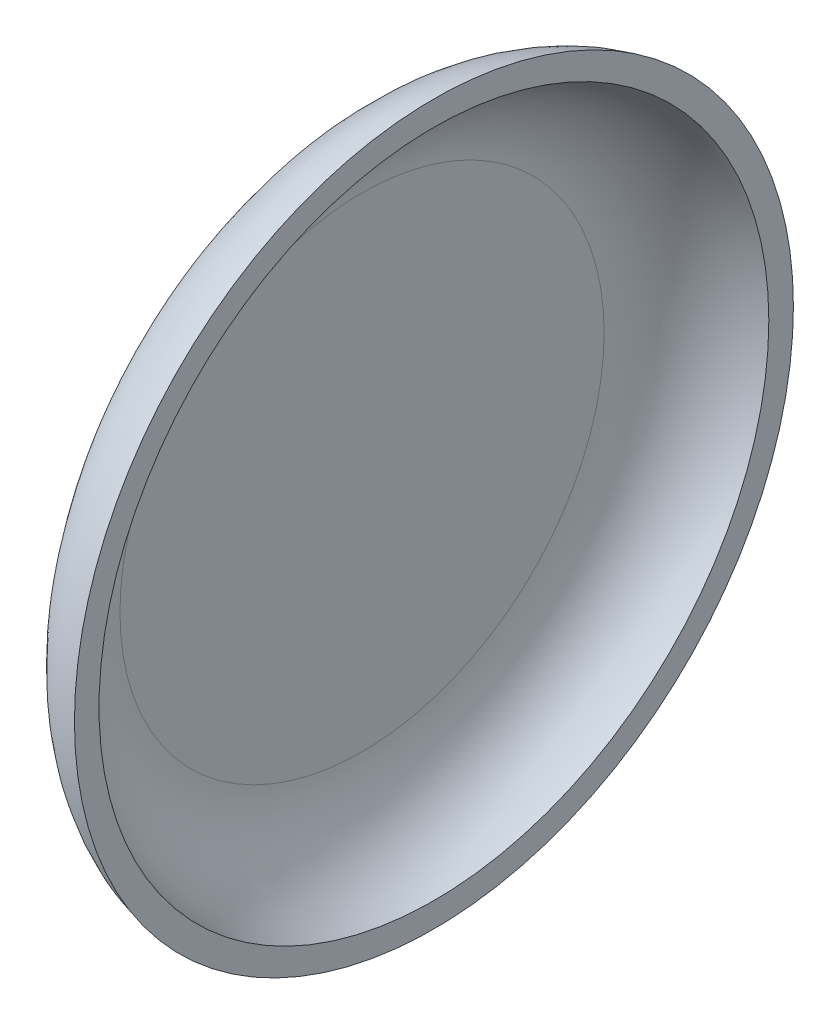
ISO-10303-21;
HEADER;
FILE_DESCRIPTION(('STEP AP214'),'2;1');
FILE_NAME('part.step','',(''),(''),'','','');
FILE_SCHEMA(('AUTOMOTIVE_DESIGN { 1 0 10303 214 1 1 1 1 }'));
ENDSEC;
DATA;
#1=APPLICATION_CONTEXT('core data for automotive mechanical design processes');
#2=APPLICATION_PROTOCOL_DEFINITION('international standard','automotive_design',2000,#1);
#3=PRODUCT_CONTEXT('',#1,'mechanical');
#4=PRODUCT('Part','Part','',(#3));
#5=PRODUCT_RELATED_PRODUCT_CATEGORY('part','',(#4));
#6=PRODUCT_DEFINITION_FORMATION('','',#4);
#7=PRODUCT_DEFINITION_CONTEXT('part definition',#1,'design');
#8=PRODUCT_DEFINITION('design','',#6,#7);
#9=PRODUCT_DEFINITION_SHAPE('','',#8);
#10=(LENGTH_UNIT() NAMED_UNIT(*) SI_UNIT(.MILLI.,.METRE.));
#11=(NAMED_UNIT(*) PLANE_ANGLE_UNIT() SI_UNIT($,.RADIAN.));
#12=(NAMED_UNIT(*) SI_UNIT($,.STERADIAN.) SOLID_ANGLE_UNIT());
#13=UNCERTAINTY_MEASURE_WITH_UNIT(LENGTH_MEASURE(1.E-05),#10,'distance_accuracy_value','');
#14=(GEOMETRIC_REPRESENTATION_CONTEXT(3) GLOBAL_UNCERTAINTY_ASSIGNED_CONTEXT((#13)) GLOBAL_UNIT_ASSIGNED_CONTEXT((#10,
#11,#12)) REPRESENTATION_CONTEXT('',''));
#15=CARTESIAN_POINT('',(0.,0.,0.));
#16=DIRECTION('',(0.,0.,1.));
#17=DIRECTION('',(1.,0.,0.));
#18=AXIS2_PLACEMENT_3D('',#15,#16,#17);
#19=CARTESIAN_POINT('',(-4.,0.,0.));
#20=DIRECTION('',(-1.,0.,0.));
#21=DIRECTION('',(0.,0.,1.));
#22=AXIS2_PLACEMENT_3D('',#19,#20,#21);
#23=PLANE('',#22);
#24=CARTESIAN_POINT('',(-4.,0.,0.));
#25=DIRECTION('',(1.,0.,0.));
#26=DIRECTION('',(0.,0.,-1.));
#27=AXIS2_PLACEMENT_3D('',#24,#25,#26);
#28=CIRCLE('',#27,10.1010205144336);
#29=CARTESIAN_POINT('',(-4.,0.,-10.1010205144336));
#30=VERTEX_POINT('',#29);
#31=EDGE_CURVE('E10',#30,#30,#28,.T.);
#32=ORIENTED_EDGE('',*,*,#31,.F.);
#33=EDGE_LOOP('',(#32));
#34=FACE_BOUND('',#33,.T.);
#35=ADVANCED_FACE('F31',(#34),#23,.T.);
#36=CARTESIAN_POINT('',(1.,0.,0.));
#37=DIRECTION('',(1.,0.,0.));
#38=DIRECTION('',(0.,0.,-1.));
#39=AXIS2_PLACEMENT_3D('',#36,#37,#38);
#40=TOROIDAL_SURFACE('',#39,10.1010205144336,5.);
#41=ORIENTED_EDGE('',*,*,#31,.T.);
#42=EDGE_LOOP('',(#41));
#43=FACE_BOUND('',#42,.T.);
#44=CARTESIAN_POINT('',(0.,0.,0.));
#45=DIRECTION('',(1.,0.,0.));
#46=DIRECTION('',(0.,0.,-1.));
#47=AXIS2_PLACEMENT_3D('',#44,#45,#46);
#48=CIRCLE('',#47,15.);
#49=CARTESIAN_POINT('',(0.,0.,-15.));
#50=VERTEX_POINT('',#49);
#51=EDGE_CURVE('E37',#50,#50,#48,.T.);
#52=ORIENTED_EDGE('',*,*,#51,.F.);
#53=EDGE_LOOP('',(#52));
#54=FACE_BOUND('',#53,.T.);
#55=ADVANCED_FACE('F63',(#43,#54),#40,.T.);
#56=CARTESIAN_POINT('',(0.,15.,0.));
#57=DIRECTION('',(1.,0.,0.));
#58=DIRECTION('',(0.,0.,-1.));
#59=AXIS2_PLACEMENT_3D('',#56,#57,#58);
#60=PLANE('',#59);
#61=ORIENTED_EDGE('',*,*,#51,.T.);
#62=EDGE_LOOP('',(#61));
#63=FACE_BOUND('',#62,.T.);
#64=CARTESIAN_POINT('',(0.,0.,0.));
#65=DIRECTION('',(1.,0.,0.));
#66=DIRECTION('',(0.,0.,-1.));
#67=AXIS2_PLACEMENT_3D('',#64,#65,#66);
#68=CIRCLE('',#67,13.9740038606411);
#69=CARTESIAN_POINT('',(0.,0.,-13.9740038606411));
#70=VERTEX_POINT('',#69);
#71=EDGE_CURVE('E41',#70,#70,#68,.T.);
#72=ORIENTED_EDGE('',*,*,#71,.F.);
#73=EDGE_LOOP('',(#72));
#74=FACE_BOUND('',#73,.T.);
#75=ADVANCED_FACE('F55',(#63,#74),#60,.T.);
#76=CARTESIAN_POINT('',(1.,0.,0.));
#77=DIRECTION('',(1.,0.,0.));
#78=DIRECTION('',(0.,0.,-1.));
#79=AXIS2_PLACEMENT_3D('',#76,#77,#78);
#80=TOROIDAL_SURFACE('',#79,10.1010205144336,4.);
#81=ORIENTED_EDGE('',*,*,#71,.T.);
#82=EDGE_LOOP('',(#81));
#83=FACE_BOUND('',#82,.T.);
#84=CARTESIAN_POINT('',(-3.,0.,0.));
#85=DIRECTION('',(1.,0.,0.));
#86=DIRECTION('',(0.,0.,-1.));
#87=AXIS2_PLACEMENT_3D('',#84,#85,#86);
#88=CIRCLE('',#87,10.1010205144336);
#89=CARTESIAN_POINT('',(-3.,0.,-10.1010205144336));
#90=VERTEX_POINT('',#89);
#91=EDGE_CURVE('E45',#90,#90,#88,.T.);
#92=ORIENTED_EDGE('',*,*,#91,.F.);
#93=EDGE_LOOP('',(#92));
#94=FACE_BOUND('',#93,.T.);
#95=ADVANCED_FACE('F53',(#83,#94),#80,.F.);
#96=CARTESIAN_POINT('',(-3.,0.,0.));
#97=DIRECTION('',(1.,0.,0.));
#98=DIRECTION('',(0.,0.,-1.));
#99=AXIS2_PLACEMENT_3D('',#96,#97,#98);
#100=PLANE('',#99);
#101=ORIENTED_EDGE('',*,*,#91,.T.);
#102=EDGE_LOOP('',(#101));
#103=FACE_BOUND('',#102,.T.);
#104=ADVANCED_FACE('F51',(#103),#100,.T.);
#105=CLOSED_SHELL('',(#35,#55,#75,#95,#104));
#106=MANIFOLD_SOLID_BREP('B2',#105);
#107=ADVANCED_BREP_SHAPE_REPRESENTATION('',(#18,#106),#14);
#108=SHAPE_DEFINITION_REPRESENTATION(#9,#107);
ENDSEC;
END-ISO-10303-21;
